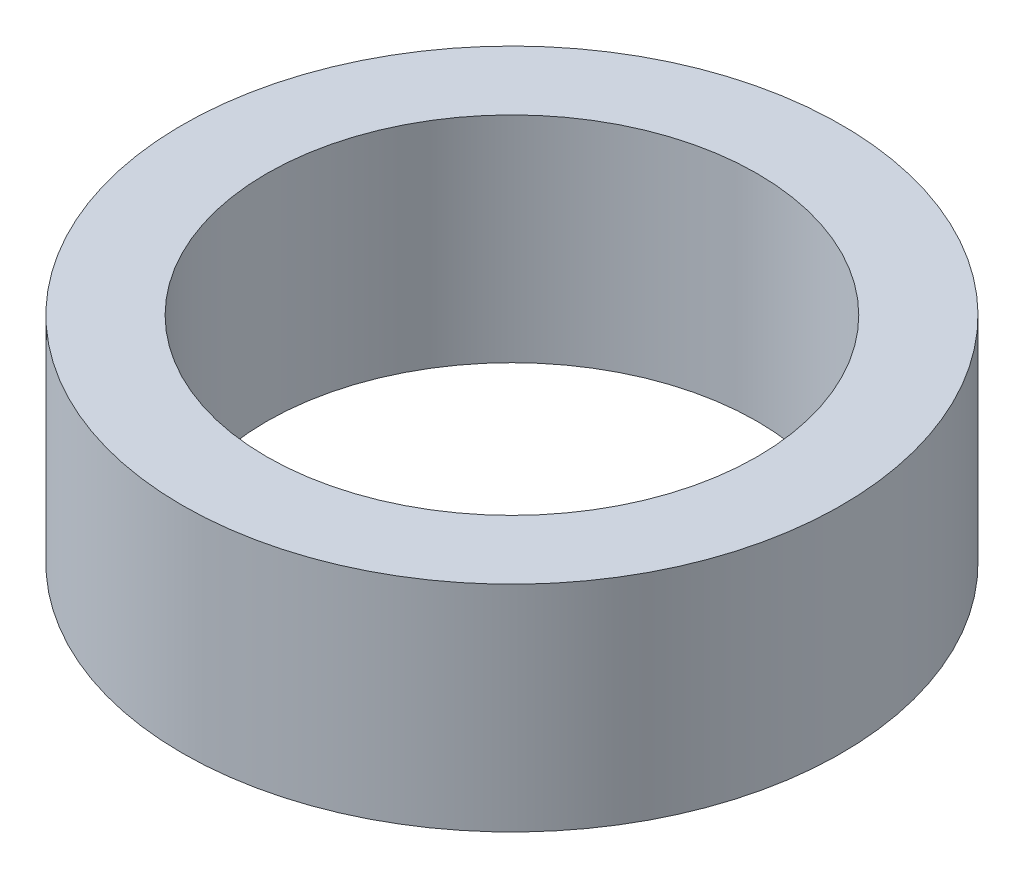
ISO-10303-21;
HEADER;
FILE_DESCRIPTION(('STEP AP214'),'2;1');
FILE_NAME('part.step','',(''),(''),'','','');
FILE_SCHEMA(('AUTOMOTIVE_DESIGN { 1 0 10303 214 1 1 1 1 }'));
ENDSEC;
DATA;
#1=APPLICATION_CONTEXT('core data for automotive mechanical design processes');
#2=APPLICATION_PROTOCOL_DEFINITION('international standard','automotive_design',2000,#1);
#3=PRODUCT_CONTEXT('',#1,'mechanical');
#4=PRODUCT('Part','Part','',(#3));
#5=PRODUCT_RELATED_PRODUCT_CATEGORY('part','',(#4));
#6=PRODUCT_DEFINITION_FORMATION('','',#4);
#7=PRODUCT_DEFINITION_CONTEXT('part definition',#1,'design');
#8=PRODUCT_DEFINITION('design','',#6,#7);
#9=PRODUCT_DEFINITION_SHAPE('','',#8);
#10=(LENGTH_UNIT() NAMED_UNIT(*) SI_UNIT(.MILLI.,.METRE.));
#11=(NAMED_UNIT(*) PLANE_ANGLE_UNIT() SI_UNIT($,.RADIAN.));
#12=(NAMED_UNIT(*) SI_UNIT($,.STERADIAN.) SOLID_ANGLE_UNIT());
#13=UNCERTAINTY_MEASURE_WITH_UNIT(LENGTH_MEASURE(1.E-05),#10,'distance_accuracy_value','');
#14=(GEOMETRIC_REPRESENTATION_CONTEXT(3) GLOBAL_UNCERTAINTY_ASSIGNED_CONTEXT((#13)) GLOBAL_UNIT_ASSIGNED_CONTEXT((#10,
#11,#12)) REPRESENTATION_CONTEXT('',''));
#15=CARTESIAN_POINT('',(0.,0.,0.));
#16=DIRECTION('',(0.,0.,1.));
#17=DIRECTION('',(1.,0.,0.));
#18=AXIS2_PLACEMENT_3D('',#15,#16,#17);
#19=CARTESIAN_POINT('',(0.,14.,0.));
#20=DIRECTION('',(0.,1.,0.));
#21=DIRECTION('',(0.,0.,1.));
#22=AXIS2_PLACEMENT_3D('',#19,#20,#21);
#23=PLANE('',#22);
#24=CARTESIAN_POINT('',(0.,14.,0.));
#25=DIRECTION('',(0.,1.,0.));
#26=DIRECTION('',(0.,0.,1.));
#27=AXIS2_PLACEMENT_3D('',#24,#25,#26);
#28=CIRCLE('',#27,21.5);
#29=CARTESIAN_POINT('',(0.,14.,21.5));
#30=VERTEX_POINT('',#29);
#31=EDGE_CURVE('E10',#30,#30,#28,.T.);
#32=ORIENTED_EDGE('',*,*,#31,.T.);
#33=EDGE_LOOP('',(#32));
#34=FACE_BOUND('',#33,.T.);
#35=CARTESIAN_POINT('',(0.,14.,0.));
#36=DIRECTION('',(0.,1.,0.));
#37=DIRECTION('',(0.,0.,1.));
#38=AXIS2_PLACEMENT_3D('',#35,#36,#37);
#39=CIRCLE('',#38,16.);
#40=CARTESIAN_POINT('',(0.,14.,16.));
#41=VERTEX_POINT('',#40);
#42=EDGE_CURVE('E41',#41,#41,#39,.T.);
#43=ORIENTED_EDGE('',*,*,#42,.F.);
#44=EDGE_LOOP('',(#43));
#45=FACE_BOUND('',#44,.T.);
#46=ADVANCED_FACE('F30',(#34,#45),#23,.T.);
#47=CARTESIAN_POINT('',(0.,0.,0.));
#48=DIRECTION('',(0.,1.,0.));
#49=DIRECTION('',(0.,0.,1.));
#50=AXIS2_PLACEMENT_3D('',#47,#48,#49);
#51=PLANE('',#50);
#52=CARTESIAN_POINT('',(0.,0.,0.));
#53=DIRECTION('',(0.,1.,0.));
#54=DIRECTION('',(0.,0.,1.));
#55=AXIS2_PLACEMENT_3D('',#52,#53,#54);
#56=CIRCLE('',#55,21.5);
#57=CARTESIAN_POINT('',(0.,0.,21.5));
#58=VERTEX_POINT('',#57);
#59=EDGE_CURVE('E34',#58,#58,#56,.T.);
#60=ORIENTED_EDGE('',*,*,#59,.F.);
#61=EDGE_LOOP('',(#60));
#62=FACE_BOUND('',#61,.T.);
#63=CARTESIAN_POINT('',(0.,0.,0.));
#64=DIRECTION('',(0.,1.,0.));
#65=DIRECTION('',(0.,0.,1.));
#66=AXIS2_PLACEMENT_3D('',#63,#64,#65);
#67=CIRCLE('',#66,16.);
#68=CARTESIAN_POINT('',(0.,0.,16.));
#69=VERTEX_POINT('',#68);
#70=EDGE_CURVE('E43',#69,#69,#67,.T.);
#71=ORIENTED_EDGE('',*,*,#70,.T.);
#72=EDGE_LOOP('',(#71));
#73=FACE_BOUND('',#72,.T.);
#74=ADVANCED_FACE('F53',(#62,#73),#51,.F.);
#75=CARTESIAN_POINT('',(0.,14.,0.));
#76=DIRECTION('',(0.,-1.,0.));
#77=DIRECTION('',(0.,0.,-1.));
#78=AXIS2_PLACEMENT_3D('',#75,#76,#77);
#79=CYLINDRICAL_SURFACE('',#78,21.5);
#80=ORIENTED_EDGE('',*,*,#31,.F.);
#81=EDGE_LOOP('',(#80));
#82=FACE_BOUND('',#81,.T.);
#83=ORIENTED_EDGE('',*,*,#59,.T.);
#84=EDGE_LOOP('',(#83));
#85=FACE_BOUND('',#84,.T.);
#86=ADVANCED_FACE('F32',(#82,#85),#79,.T.);
#87=CARTESIAN_POINT('',(0.,14.,0.));
#88=DIRECTION('',(0.,-1.,0.));
#89=DIRECTION('',(0.,0.,-1.));
#90=AXIS2_PLACEMENT_3D('',#87,#88,#89);
#91=CYLINDRICAL_SURFACE('',#90,16.);
#92=ORIENTED_EDGE('',*,*,#42,.T.);
#93=EDGE_LOOP('',(#92));
#94=FACE_BOUND('',#93,.T.);
#95=ORIENTED_EDGE('',*,*,#70,.F.);
#96=EDGE_LOOP('',(#95));
#97=FACE_BOUND('',#96,.T.);
#98=ADVANCED_FACE('F49',(#94,#97),#91,.F.);
#99=CLOSED_SHELL('',(#46,#74,#86,#98));
#100=MANIFOLD_SOLID_BREP('B2',#99);
#101=ADVANCED_BREP_SHAPE_REPRESENTATION('',(#18,#100),#14);
#102=SHAPE_DEFINITION_REPRESENTATION(#9,#101);
ENDSEC;
END-ISO-10303-21;
